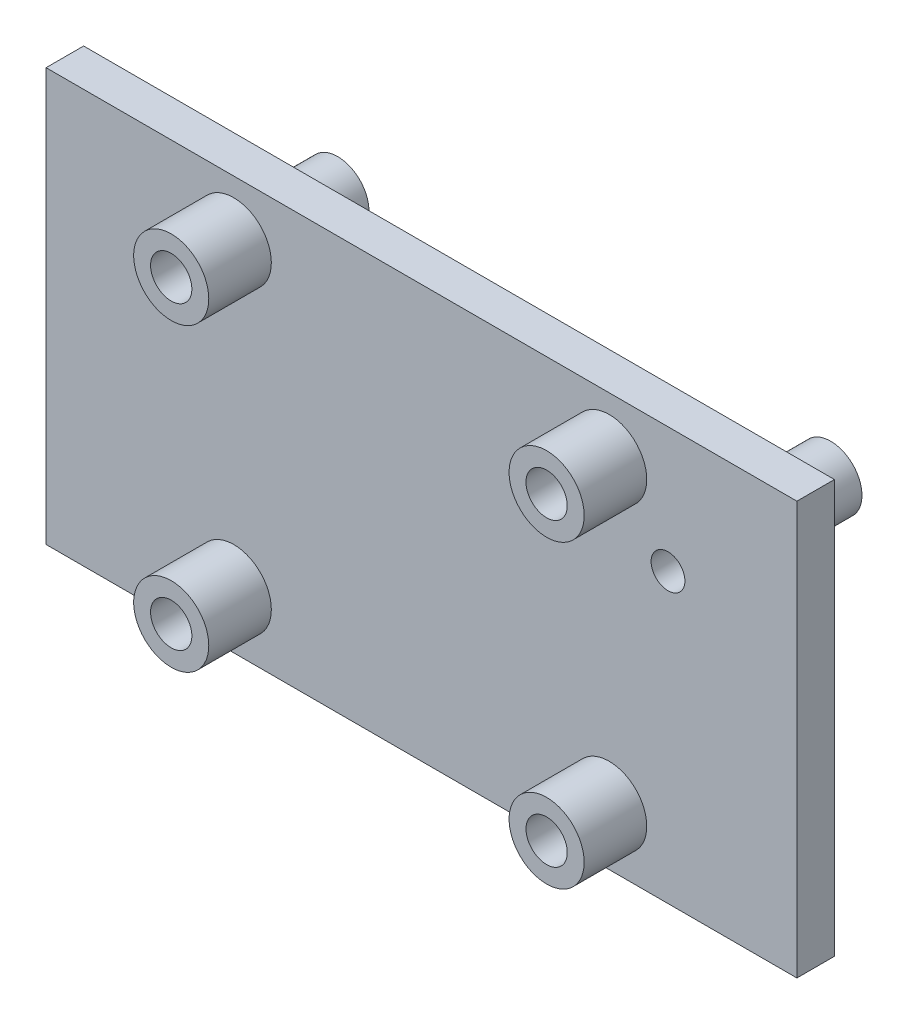
ISO-10303-21;
HEADER;
FILE_DESCRIPTION(('STEP AP214'),'2;1');
FILE_NAME('part.step','',(''),(''),'','','');
FILE_SCHEMA(('AUTOMOTIVE_DESIGN { 1 0 10303 214 1 1 1 1 }'));
ENDSEC;
DATA;
#1=APPLICATION_CONTEXT('core data for automotive mechanical design processes');
#2=APPLICATION_PROTOCOL_DEFINITION('international standard','automotive_design',2000,#1);
#3=PRODUCT_CONTEXT('',#1,'mechanical');
#4=PRODUCT('Part','Part','',(#3));
#5=PRODUCT_RELATED_PRODUCT_CATEGORY('part','',(#4));
#6=PRODUCT_DEFINITION_FORMATION('','',#4);
#7=PRODUCT_DEFINITION_CONTEXT('part definition',#1,'design');
#8=PRODUCT_DEFINITION('design','',#6,#7);
#9=PRODUCT_DEFINITION_SHAPE('','',#8);
#10=(LENGTH_UNIT() NAMED_UNIT(*) SI_UNIT(.MILLI.,.METRE.));
#11=(NAMED_UNIT(*) PLANE_ANGLE_UNIT() SI_UNIT($,.RADIAN.));
#12=(NAMED_UNIT(*) SI_UNIT($,.STERADIAN.) SOLID_ANGLE_UNIT());
#13=UNCERTAINTY_MEASURE_WITH_UNIT(LENGTH_MEASURE(1.E-05),#10,'distance_accuracy_value','');
#14=(GEOMETRIC_REPRESENTATION_CONTEXT(3) GLOBAL_UNCERTAINTY_ASSIGNED_CONTEXT((#13)) GLOBAL_UNIT_ASSIGNED_CONTEXT((#10,
#11,#12)) REPRESENTATION_CONTEXT('',''));
#15=CARTESIAN_POINT('',(0.,0.,0.));
#16=DIRECTION('',(0.,0.,1.));
#17=DIRECTION('',(1.,0.,0.));
#18=AXIS2_PLACEMENT_3D('',#15,#16,#17);
#19=CARTESIAN_POINT('',(196.000002473593,10.,0.));
#20=DIRECTION('',(0.,0.,1.));
#21=DIRECTION('',(1.,0.,0.));
#22=AXIS2_PLACEMENT_3D('',#19,#20,#21);
#23=PLANE('',#22);
#24=CARTESIAN_POINT('',(181.000002473593,22.,0.));
#25=DIRECTION('',(0.,0.,-1.));
#26=DIRECTION('',(1.,0.,0.));
#27=AXIS2_PLACEMENT_3D('',#24,#25,#26);
#28=CIRCLE('',#27,1.65);
#29=CARTESIAN_POINT('',(179.350002473593,22.,0.));
#30=VERTEX_POINT('',#29);
#31=EDGE_CURVE('E280',#30,#30,#28,.T.);
#32=ORIENTED_EDGE('',*,*,#31,.F.);
#33=EDGE_LOOP('',(#32));
#34=FACE_BOUND('',#33,.T.);
#35=CARTESIAN_POINT('',(211.000002473593,22.,0.));
#36=DIRECTION('',(0.,0.,-1.));
#37=DIRECTION('',(1.,0.,0.));
#38=AXIS2_PLACEMENT_3D('',#35,#36,#37);
#39=CIRCLE('',#38,1.65);
#40=CARTESIAN_POINT('',(209.350002473593,22.,0.));
#41=VERTEX_POINT('',#40);
#42=EDGE_CURVE('E292',#41,#41,#39,.T.);
#43=ORIENTED_EDGE('',*,*,#42,.F.);
#44=EDGE_LOOP('',(#43));
#45=FACE_BOUND('',#44,.T.);
#46=CARTESIAN_POINT('',(211.000002473593,-2.,0.));
#47=DIRECTION('',(0.,0.,-1.));
#48=DIRECTION('',(1.,0.,0.));
#49=AXIS2_PLACEMENT_3D('',#46,#47,#48);
#50=CIRCLE('',#49,1.65);
#51=CARTESIAN_POINT('',(209.350002473593,-2.,0.));
#52=VERTEX_POINT('',#51);
#53=EDGE_CURVE('E183',#52,#52,#50,.T.);
#54=ORIENTED_EDGE('',*,*,#53,.F.);
#55=EDGE_LOOP('',(#54));
#56=FACE_BOUND('',#55,.T.);
#57=CARTESIAN_POINT('',(181.000002473593,-2.,0.));
#58=DIRECTION('',(0.,0.,-1.));
#59=DIRECTION('',(1.,0.,0.));
#60=AXIS2_PLACEMENT_3D('',#57,#58,#59);
#61=CIRCLE('',#60,1.65);
#62=CARTESIAN_POINT('',(179.350002473593,-2.,0.));
#63=VERTEX_POINT('',#62);
#64=EDGE_CURVE('E165',#63,#63,#61,.T.);
#65=ORIENTED_EDGE('',*,*,#64,.F.);
#66=EDGE_LOOP('',(#65));
#67=FACE_BOUND('',#66,.T.);
#68=CARTESIAN_POINT('',(215.700002473593,16.5,0.));
#69=DIRECTION('',(0.,0.,1.));
#70=DIRECTION('',(1.,0.,0.));
#71=AXIS2_PLACEMENT_3D('',#68,#69,#70);
#72=CIRCLE('',#71,2.5);
#73=CARTESIAN_POINT('',(213.200002473593,16.5,0.));
#74=VERTEX_POINT('',#73);
#75=EDGE_CURVE('E269',#74,#74,#72,.T.);
#76=ORIENTED_EDGE('',*,*,#75,.T.);
#77=EDGE_LOOP('',(#76));
#78=FACE_BOUND('',#77,.T.);
#79=CARTESIAN_POINT('',(176.300002473593,16.5,0.));
#80=DIRECTION('',(0.,0.,1.));
#81=DIRECTION('',(1.,0.,0.));
#82=AXIS2_PLACEMENT_3D('',#79,#80,#81);
#83=CIRCLE('',#82,2.5);
#84=CARTESIAN_POINT('',(173.800002473593,16.5,0.));
#85=VERTEX_POINT('',#84);
#86=EDGE_CURVE('E220',#85,#85,#83,.T.);
#87=ORIENTED_EDGE('',*,*,#86,.T.);
#88=EDGE_LOOP('',(#87));
#89=FACE_BOUND('',#88,.T.);
#90=DIRECTION('',(0.,-1.,0.));
#91=VECTOR('',#90,1.);
#92=CARTESIAN_POINT('',(166.000002473593,26.5,0.));
#93=LINE('',#92,#91);
#94=CARTESIAN_POINT('',(166.000002473593,26.5,0.));
#95=VERTEX_POINT('',#94);
#96=CARTESIAN_POINT('',(166.000002473593,-6.5,0.));
#97=VERTEX_POINT('',#96);
#98=EDGE_CURVE('E25',#95,#97,#93,.T.);
#99=ORIENTED_EDGE('',*,*,#98,.F.);
#100=DIRECTION('',(-1.,0.,0.));
#101=VECTOR('',#100,1.);
#102=CARTESIAN_POINT('',(226.000002473593,26.5,0.));
#103=LINE('',#102,#101);
#104=CARTESIAN_POINT('',(226.000002473593,26.5,0.));
#105=VERTEX_POINT('',#104);
#106=EDGE_CURVE('E172',#105,#95,#103,.T.);
#107=ORIENTED_EDGE('',*,*,#106,.F.);
#108=DIRECTION('',(0.,1.,0.));
#109=VECTOR('',#108,1.);
#110=CARTESIAN_POINT('',(226.000002473593,-6.5,0.));
#111=LINE('',#110,#109);
#112=CARTESIAN_POINT('',(226.000002473593,-6.5,0.));
#113=VERTEX_POINT('',#112);
#114=EDGE_CURVE('E194',#113,#105,#111,.T.);
#115=ORIENTED_EDGE('',*,*,#114,.F.);
#116=DIRECTION('',(1.,0.,0.));
#117=VECTOR('',#116,1.);
#118=CARTESIAN_POINT('',(166.000002473593,-6.5,0.));
#119=LINE('',#118,#117);
#120=EDGE_CURVE('E195',#97,#113,#119,.T.);
#121=ORIENTED_EDGE('',*,*,#120,.F.);
#122=EDGE_LOOP('',(#99,#107,#115,#121));
#123=FACE_BOUND('',#122,.T.);
#124=ADVANCED_FACE('F17',(#34,#45,#56,#67,#78,#89,#123),#23,.F.);
#125=CARTESIAN_POINT('',(196.000002473593,10.,3.));
#126=DIRECTION('',(0.,0.,1.));
#127=DIRECTION('',(1.,0.,0.));
#128=AXIS2_PLACEMENT_3D('',#125,#126,#127);
#129=PLANE('',#128);
#130=CARTESIAN_POINT('',(176.300002473593,16.5,3.));
#131=DIRECTION('',(0.,0.,-1.));
#132=DIRECTION('',(1.,0.,0.));
#133=AXIS2_PLACEMENT_3D('',#130,#131,#132);
#134=CIRCLE('',#133,1.35000000000002);
#135=CARTESIAN_POINT('',(174.950002473593,16.5,3.));
#136=VERTEX_POINT('',#135);
#137=EDGE_CURVE('E283',#136,#136,#134,.T.);
#138=ORIENTED_EDGE('',*,*,#137,.T.);
#139=EDGE_LOOP('',(#138));
#140=FACE_BOUND('',#139,.T.);
#141=CARTESIAN_POINT('',(215.700002473593,16.5,3.));
#142=DIRECTION('',(0.,0.,-1.));
#143=DIRECTION('',(1.,0.,0.));
#144=AXIS2_PLACEMENT_3D('',#141,#142,#143);
#145=CIRCLE('',#144,1.34999999999998);
#146=CARTESIAN_POINT('',(214.350002473593,16.5,3.));
#147=VERTEX_POINT('',#146);
#148=EDGE_CURVE('E240',#147,#147,#145,.T.);
#149=ORIENTED_EDGE('',*,*,#148,.T.);
#150=EDGE_LOOP('',(#149));
#151=FACE_BOUND('',#150,.T.);
#152=CARTESIAN_POINT('',(211.000002473593,22.,3.));
#153=DIRECTION('',(0.,0.,-1.));
#154=DIRECTION('',(-1.,0.,0.));
#155=AXIS2_PLACEMENT_3D('',#152,#153,#154);
#156=CIRCLE('',#155,3.);
#157=CARTESIAN_POINT('',(214.000002473593,22.,3.));
#158=VERTEX_POINT('',#157);
#159=EDGE_CURVE('E254',#158,#158,#156,.T.);
#160=ORIENTED_EDGE('',*,*,#159,.T.);
#161=EDGE_LOOP('',(#160));
#162=FACE_BOUND('',#161,.T.);
#163=CARTESIAN_POINT('',(181.000002473593,22.,3.));
#164=DIRECTION('',(0.,0.,-1.));
#165=DIRECTION('',(-1.,0.,0.));
#166=AXIS2_PLACEMENT_3D('',#163,#164,#165);
#167=CIRCLE('',#166,3.0000004693866);
#168=CARTESIAN_POINT('',(184.000002942979,22.,3.));
#169=VERTEX_POINT('',#168);
#170=EDGE_CURVE('E245',#169,#169,#167,.T.);
#171=ORIENTED_EDGE('',*,*,#170,.T.);
#172=EDGE_LOOP('',(#171));
#173=FACE_BOUND('',#172,.T.);
#174=CARTESIAN_POINT('',(211.000002473593,-2.,3.));
#175=DIRECTION('',(0.,0.,-1.));
#176=DIRECTION('',(-1.,0.,0.));
#177=AXIS2_PLACEMENT_3D('',#174,#175,#176);
#178=CIRCLE('',#177,3.);
#179=CARTESIAN_POINT('',(214.000002473593,-2.,3.));
#180=VERTEX_POINT('',#179);
#181=EDGE_CURVE('E230',#180,#180,#178,.T.);
#182=ORIENTED_EDGE('',*,*,#181,.T.);
#183=EDGE_LOOP('',(#182));
#184=FACE_BOUND('',#183,.T.);
#185=CARTESIAN_POINT('',(181.000002473593,-2.,3.));
#186=DIRECTION('',(0.,0.,-1.));
#187=DIRECTION('',(-1.,0.,0.));
#188=AXIS2_PLACEMENT_3D('',#185,#186,#187);
#189=CIRCLE('',#188,3.);
#190=CARTESIAN_POINT('',(184.000002473593,-2.,3.));
#191=VERTEX_POINT('',#190);
#192=EDGE_CURVE('E436',#191,#191,#189,.T.);
#193=ORIENTED_EDGE('',*,*,#192,.T.);
#194=EDGE_LOOP('',(#193));
#195=FACE_BOUND('',#194,.T.);
#196=DIRECTION('',(0.,-1.,0.));
#197=VECTOR('',#196,1.);
#198=CARTESIAN_POINT('',(166.000002473593,26.5,3.));
#199=LINE('',#198,#197);
#200=CARTESIAN_POINT('',(166.000002473593,26.5,3.));
#201=VERTEX_POINT('',#200);
#202=CARTESIAN_POINT('',(166.000002473593,-6.5,3.));
#203=VERTEX_POINT('',#202);
#204=EDGE_CURVE('E11',#201,#203,#199,.T.);
#205=ORIENTED_EDGE('',*,*,#204,.T.);
#206=DIRECTION('',(1.,0.,0.));
#207=VECTOR('',#206,1.);
#208=CARTESIAN_POINT('',(166.000002473593,-6.5,3.));
#209=LINE('',#208,#207);
#210=CARTESIAN_POINT('',(226.000002473593,-6.5,3.));
#211=VERTEX_POINT('',#210);
#212=EDGE_CURVE('E198',#203,#211,#209,.T.);
#213=ORIENTED_EDGE('',*,*,#212,.T.);
#214=DIRECTION('',(0.,1.,0.));
#215=VECTOR('',#214,1.);
#216=CARTESIAN_POINT('',(226.000002473593,-6.5,3.));
#217=LINE('',#216,#215);
#218=CARTESIAN_POINT('',(226.000002473593,26.5,3.));
#219=VERTEX_POINT('',#218);
#220=EDGE_CURVE('E202',#211,#219,#217,.T.);
#221=ORIENTED_EDGE('',*,*,#220,.T.);
#222=DIRECTION('',(-1.,0.,0.));
#223=VECTOR('',#222,1.);
#224=CARTESIAN_POINT('',(226.000002473593,26.5,3.));
#225=LINE('',#224,#223);
#226=EDGE_CURVE('E187',#219,#201,#225,.T.);
#227=ORIENTED_EDGE('',*,*,#226,.T.);
#228=EDGE_LOOP('',(#205,#213,#221,#227));
#229=FACE_BOUND('',#228,.T.);
#230=ADVANCED_FACE('F310',(#140,#151,#162,#173,#184,#195,#229),#129,.T.);
#231=CARTESIAN_POINT('',(166.000002473593,26.5,0.));
#232=DIRECTION('',(-1.,0.,0.));
#233=DIRECTION('',(0.,0.,1.));
#234=AXIS2_PLACEMENT_3D('',#231,#232,#233);
#235=PLANE('',#234);
#236=ORIENTED_EDGE('',*,*,#98,.T.);
#237=DIRECTION('',(0.,0.,1.));
#238=VECTOR('',#237,1.);
#239=CARTESIAN_POINT('',(166.000002473593,-6.5,0.));
#240=LINE('',#239,#238);
#241=EDGE_CURVE('E207',#97,#203,#240,.T.);
#242=ORIENTED_EDGE('',*,*,#241,.T.);
#243=ORIENTED_EDGE('',*,*,#204,.F.);
#244=DIRECTION('',(0.,0.,1.));
#245=VECTOR('',#244,1.);
#246=CARTESIAN_POINT('',(166.000002473593,26.5,0.));
#247=LINE('',#246,#245);
#248=EDGE_CURVE('E180',#95,#201,#247,.T.);
#249=ORIENTED_EDGE('',*,*,#248,.F.);
#250=EDGE_LOOP('',(#236,#242,#243,#249));
#251=FACE_BOUND('',#250,.T.);
#252=ADVANCED_FACE('F321',(#251),#235,.T.);
#253=CARTESIAN_POINT('',(166.000002473593,-6.5,0.));
#254=DIRECTION('',(0.,-1.,0.));
#255=DIRECTION('',(0.,0.,-1.));
#256=AXIS2_PLACEMENT_3D('',#253,#254,#255);
#257=PLANE('',#256);
#258=ORIENTED_EDGE('',*,*,#120,.T.);
#259=DIRECTION('',(0.,0.,1.));
#260=VECTOR('',#259,1.);
#261=CARTESIAN_POINT('',(226.000002473593,-6.5,0.));
#262=LINE('',#261,#260);
#263=EDGE_CURVE('E199',#113,#211,#262,.T.);
#264=ORIENTED_EDGE('',*,*,#263,.T.);
#265=ORIENTED_EDGE('',*,*,#212,.F.);
#266=ORIENTED_EDGE('',*,*,#241,.F.);
#267=EDGE_LOOP('',(#258,#264,#265,#266));
#268=FACE_BOUND('',#267,.T.);
#269=ADVANCED_FACE('F331',(#268),#257,.T.);
#270=CARTESIAN_POINT('',(226.000002473593,-6.5,0.));
#271=DIRECTION('',(1.,0.,0.));
#272=DIRECTION('',(0.,1.,0.));
#273=AXIS2_PLACEMENT_3D('',#270,#271,#272);
#274=PLANE('',#273);
#275=ORIENTED_EDGE('',*,*,#114,.T.);
#276=DIRECTION('',(0.,0.,1.));
#277=VECTOR('',#276,1.);
#278=CARTESIAN_POINT('',(226.000002473593,26.5,0.));
#279=LINE('',#278,#277);
#280=EDGE_CURVE('E190',#105,#219,#279,.T.);
#281=ORIENTED_EDGE('',*,*,#280,.T.);
#282=ORIENTED_EDGE('',*,*,#220,.F.);
#283=ORIENTED_EDGE('',*,*,#263,.F.);
#284=EDGE_LOOP('',(#275,#281,#282,#283));
#285=FACE_BOUND('',#284,.T.);
#286=ADVANCED_FACE('F328',(#285),#274,.T.);
#287=CARTESIAN_POINT('',(226.000002473593,26.5,0.));
#288=DIRECTION('',(0.,1.,0.));
#289=DIRECTION('',(1.,0.,0.));
#290=AXIS2_PLACEMENT_3D('',#287,#288,#289);
#291=PLANE('',#290);
#292=ORIENTED_EDGE('',*,*,#106,.T.);
#293=ORIENTED_EDGE('',*,*,#248,.T.);
#294=ORIENTED_EDGE('',*,*,#226,.F.);
#295=ORIENTED_EDGE('',*,*,#280,.F.);
#296=EDGE_LOOP('',(#292,#293,#294,#295));
#297=FACE_BOUND('',#296,.T.);
#298=ADVANCED_FACE('F325',(#297),#291,.T.);
#299=CARTESIAN_POINT('',(181.000002473593,-2.,0.));
#300=DIRECTION('',(0.,0.,1.));
#301=DIRECTION('',(1.,0.,0.));
#302=AXIS2_PLACEMENT_3D('',#299,#300,#301);
#303=CYLINDRICAL_SURFACE('',#302,1.65);
#304=CARTESIAN_POINT('',(181.000002473593,-2.,8.));
#305=DIRECTION('',(0.,0.,-1.));
#306=DIRECTION('',(-1.,0.,0.));
#307=AXIS2_PLACEMENT_3D('',#304,#305,#306);
#308=CIRCLE('',#307,1.65);
#309=CARTESIAN_POINT('',(179.350002473593,-2.,8.));
#310=VERTEX_POINT('',#309);
#311=EDGE_CURVE('E338',#310,#310,#308,.T.);
#312=ORIENTED_EDGE('',*,*,#311,.F.);
#313=DIRECTION('',(0.,0.,-1.));
#314=VECTOR('',#313,1.);
#315=CARTESIAN_POINT('',(179.350002473593,-2.,0.));
#316=LINE('',#315,#314);
#317=EDGE_CURVE('E168',#310,#63,#316,.T.);
#318=ORIENTED_EDGE('',*,*,#317,.T.);
#319=ORIENTED_EDGE('',*,*,#64,.T.);
#320=ORIENTED_EDGE('',*,*,#317,.F.);
#321=EDGE_LOOP('',(#312,#318,#319,#320));
#322=FACE_BOUND('',#321,.T.);
#323=ADVANCED_FACE('F167',(#322),#303,.F.);
#324=CARTESIAN_POINT('',(211.000002473593,-2.,0.));
#325=DIRECTION('',(0.,0.,1.));
#326=DIRECTION('',(1.,0.,0.));
#327=AXIS2_PLACEMENT_3D('',#324,#325,#326);
#328=CYLINDRICAL_SURFACE('',#327,1.65);
#329=CARTESIAN_POINT('',(211.000002473593,-2.,8.));
#330=DIRECTION('',(0.,0.,-1.));
#331=DIRECTION('',(-1.,0.,0.));
#332=AXIS2_PLACEMENT_3D('',#329,#330,#331);
#333=CIRCLE('',#332,1.65);
#334=CARTESIAN_POINT('',(209.350002473593,-2.,8.));
#335=VERTEX_POINT('',#334);
#336=EDGE_CURVE('E225',#335,#335,#333,.T.);
#337=ORIENTED_EDGE('',*,*,#336,.F.);
#338=DIRECTION('',(0.,0.,-1.));
#339=VECTOR('',#338,1.);
#340=CARTESIAN_POINT('',(209.350002473593,-2.,0.));
#341=LINE('',#340,#339);
#342=EDGE_CURVE('E239',#335,#52,#341,.T.);
#343=ORIENTED_EDGE('',*,*,#342,.T.);
#344=ORIENTED_EDGE('',*,*,#53,.T.);
#345=ORIENTED_EDGE('',*,*,#342,.F.);
#346=EDGE_LOOP('',(#337,#343,#344,#345));
#347=FACE_BOUND('',#346,.T.);
#348=ADVANCED_FACE('F307',(#347),#328,.F.);
#349=CARTESIAN_POINT('',(215.700002473593,16.5,0.));
#350=DIRECTION('',(0.,0.,1.));
#351=DIRECTION('',(1.,0.,0.));
#352=AXIS2_PLACEMENT_3D('',#349,#350,#351);
#353=CYLINDRICAL_SURFACE('',#352,1.34999999999998);
#354=ORIENTED_EDGE('',*,*,#148,.F.);
#355=DIRECTION('',(0.,0.,-1.));
#356=VECTOR('',#355,1.);
#357=CARTESIAN_POINT('',(214.350002473593,16.5,0.));
#358=LINE('',#357,#356);
#359=CARTESIAN_POINT('',(214.350002473593,16.5,-10.));
#360=VERTEX_POINT('',#359);
#361=EDGE_CURVE('E236',#147,#360,#358,.T.);
#362=ORIENTED_EDGE('',*,*,#361,.T.);
#363=CARTESIAN_POINT('',(215.700002473593,16.5,-10.));
#364=DIRECTION('',(0.,0.,1.));
#365=DIRECTION('',(1.,0.,0.));
#366=AXIS2_PLACEMENT_3D('',#363,#364,#365);
#367=CIRCLE('',#366,1.34999999999998);
#368=EDGE_CURVE('E272',#360,#360,#367,.T.);
#369=ORIENTED_EDGE('',*,*,#368,.F.);
#370=ORIENTED_EDGE('',*,*,#361,.F.);
#371=EDGE_LOOP('',(#354,#362,#369,#370));
#372=FACE_BOUND('',#371,.T.);
#373=ADVANCED_FACE('F408',(#372),#353,.F.);
#374=CARTESIAN_POINT('',(211.000002473593,22.,0.));
#375=DIRECTION('',(0.,0.,1.));
#376=DIRECTION('',(1.,0.,0.));
#377=AXIS2_PLACEMENT_3D('',#374,#375,#376);
#378=CYLINDRICAL_SURFACE('',#377,1.65);
#379=CARTESIAN_POINT('',(211.000002473593,22.,8.));
#380=DIRECTION('',(0.,0.,-1.));
#381=DIRECTION('',(-1.,0.,0.));
#382=AXIS2_PLACEMENT_3D('',#379,#380,#381);
#383=CIRCLE('',#382,1.65);
#384=CARTESIAN_POINT('',(209.350002473593,22.,8.));
#385=VERTEX_POINT('',#384);
#386=EDGE_CURVE('E342',#385,#385,#383,.T.);
#387=ORIENTED_EDGE('',*,*,#386,.F.);
#388=DIRECTION('',(0.,0.,-1.));
#389=VECTOR('',#388,1.);
#390=CARTESIAN_POINT('',(209.350002473593,22.,0.));
#391=LINE('',#390,#389);
#392=EDGE_CURVE('E288',#385,#41,#391,.T.);
#393=ORIENTED_EDGE('',*,*,#392,.T.);
#394=ORIENTED_EDGE('',*,*,#42,.T.);
#395=ORIENTED_EDGE('',*,*,#392,.F.);
#396=EDGE_LOOP('',(#387,#393,#394,#395));
#397=FACE_BOUND('',#396,.T.);
#398=ADVANCED_FACE('F392',(#397),#378,.F.);
#399=CARTESIAN_POINT('',(176.300002473593,16.5,0.));
#400=DIRECTION('',(0.,0.,1.));
#401=DIRECTION('',(1.,0.,0.));
#402=AXIS2_PLACEMENT_3D('',#399,#400,#401);
#403=CYLINDRICAL_SURFACE('',#402,1.35000000000002);
#404=ORIENTED_EDGE('',*,*,#137,.F.);
#405=DIRECTION('',(0.,0.,-1.));
#406=VECTOR('',#405,1.);
#407=CARTESIAN_POINT('',(174.950002473593,16.5,0.));
#408=LINE('',#407,#406);
#409=CARTESIAN_POINT('',(174.950002473593,16.5,-10.));
#410=VERTEX_POINT('',#409);
#411=EDGE_CURVE('E287',#136,#410,#408,.T.);
#412=ORIENTED_EDGE('',*,*,#411,.T.);
#413=CARTESIAN_POINT('',(176.300002473593,16.5,-10.));
#414=DIRECTION('',(0.,0.,1.));
#415=DIRECTION('',(1.,0.,0.));
#416=AXIS2_PLACEMENT_3D('',#413,#414,#415);
#417=CIRCLE('',#416,1.35000000000002);
#418=EDGE_CURVE('E223',#410,#410,#417,.T.);
#419=ORIENTED_EDGE('',*,*,#418,.F.);
#420=ORIENTED_EDGE('',*,*,#411,.F.);
#421=EDGE_LOOP('',(#404,#412,#419,#420));
#422=FACE_BOUND('',#421,.T.);
#423=ADVANCED_FACE('F376',(#422),#403,.F.);
#424=CARTESIAN_POINT('',(181.000002473593,22.,0.));
#425=DIRECTION('',(0.,0.,1.));
#426=DIRECTION('',(1.,0.,0.));
#427=AXIS2_PLACEMENT_3D('',#424,#425,#426);
#428=CYLINDRICAL_SURFACE('',#427,1.65);
#429=CARTESIAN_POINT('',(181.000002473593,22.,8.));
#430=DIRECTION('',(0.,0.,-1.));
#431=DIRECTION('',(-1.,0.,0.));
#432=AXIS2_PLACEMENT_3D('',#429,#430,#431);
#433=CIRCLE('',#432,1.65);
#434=CARTESIAN_POINT('',(179.350002473593,22.,8.));
#435=VERTEX_POINT('',#434);
#436=EDGE_CURVE('E235',#435,#435,#433,.T.);
#437=ORIENTED_EDGE('',*,*,#436,.F.);
#438=DIRECTION('',(0.,0.,-1.));
#439=VECTOR('',#438,1.);
#440=CARTESIAN_POINT('',(179.350002473593,22.,0.));
#441=LINE('',#440,#439);
#442=EDGE_CURVE('E276',#435,#30,#441,.T.);
#443=ORIENTED_EDGE('',*,*,#442,.T.);
#444=ORIENTED_EDGE('',*,*,#31,.T.);
#445=ORIENTED_EDGE('',*,*,#442,.F.);
#446=EDGE_LOOP('',(#437,#443,#444,#445));
#447=FACE_BOUND('',#446,.T.);
#448=ADVANCED_FACE('F372',(#447),#428,.F.);
#449=CARTESIAN_POINT('',(215.700002473593,16.5,-10.));
#450=DIRECTION('',(0.,0.,-1.));
#451=DIRECTION('',(0.,-1.,0.));
#452=AXIS2_PLACEMENT_3D('',#449,#450,#451);
#453=PLANE('',#452);
#454=ORIENTED_EDGE('',*,*,#368,.T.);
#455=EDGE_LOOP('',(#454));
#456=FACE_BOUND('',#455,.T.);
#457=CARTESIAN_POINT('',(215.700002473593,16.5,-10.));
#458=DIRECTION('',(0.,0.,-1.));
#459=DIRECTION('',(1.,0.,0.));
#460=AXIS2_PLACEMENT_3D('',#457,#458,#459);
#461=CIRCLE('',#460,2.5);
#462=CARTESIAN_POINT('',(213.200002473593,16.5,-10.));
#463=VERTEX_POINT('',#462);
#464=EDGE_CURVE('E262',#463,#463,#461,.T.);
#465=ORIENTED_EDGE('',*,*,#464,.T.);
#466=EDGE_LOOP('',(#465));
#467=FACE_BOUND('',#466,.T.);
#468=ADVANCED_FACE('F375',(#456,#467),#453,.T.);
#469=CARTESIAN_POINT('',(215.700002473593,16.5,0.));
#470=DIRECTION('',(0.,0.,-1.));
#471=DIRECTION('',(1.,0.,0.));
#472=AXIS2_PLACEMENT_3D('',#469,#470,#471);
#473=CYLINDRICAL_SURFACE('',#472,2.5);
#474=ORIENTED_EDGE('',*,*,#464,.F.);
#475=DIRECTION('',(0.,0.,1.));
#476=VECTOR('',#475,1.);
#477=CARTESIAN_POINT('',(213.200002473593,16.5,0.));
#478=LINE('',#477,#476);
#479=EDGE_CURVE('E266',#463,#74,#478,.T.);
#480=ORIENTED_EDGE('',*,*,#479,.T.);
#481=ORIENTED_EDGE('',*,*,#75,.F.);
#482=ORIENTED_EDGE('',*,*,#479,.F.);
#483=EDGE_LOOP('',(#474,#480,#481,#482));
#484=FACE_BOUND('',#483,.T.);
#485=ADVANCED_FACE('F400',(#484),#473,.T.);
#486=CARTESIAN_POINT('',(176.300002473593,16.5,-10.));
#487=DIRECTION('',(0.,0.,-1.));
#488=DIRECTION('',(0.,-1.,0.));
#489=AXIS2_PLACEMENT_3D('',#486,#487,#488);
#490=PLANE('',#489);
#491=ORIENTED_EDGE('',*,*,#418,.T.);
#492=EDGE_LOOP('',(#491));
#493=FACE_BOUND('',#492,.T.);
#494=CARTESIAN_POINT('',(176.300002473593,16.5,-10.));
#495=DIRECTION('',(0.,0.,-1.));
#496=DIRECTION('',(1.,0.,0.));
#497=AXIS2_PLACEMENT_3D('',#494,#495,#496);
#498=CIRCLE('',#497,2.5);
#499=CARTESIAN_POINT('',(173.800002473593,16.5,-10.));
#500=VERTEX_POINT('',#499);
#501=EDGE_CURVE('E258',#500,#500,#498,.T.);
#502=ORIENTED_EDGE('',*,*,#501,.T.);
#503=EDGE_LOOP('',(#502));
#504=FACE_BOUND('',#503,.T.);
#505=ADVANCED_FACE('F396',(#493,#504),#490,.T.);
#506=CARTESIAN_POINT('',(176.300002473593,16.5,0.));
#507=DIRECTION('',(0.,0.,-1.));
#508=DIRECTION('',(1.,0.,0.));
#509=AXIS2_PLACEMENT_3D('',#506,#507,#508);
#510=CYLINDRICAL_SURFACE('',#509,2.5);
#511=ORIENTED_EDGE('',*,*,#501,.F.);
#512=DIRECTION('',(0.,0.,1.));
#513=VECTOR('',#512,1.);
#514=CARTESIAN_POINT('',(173.800002473593,16.5,0.));
#515=LINE('',#514,#513);
#516=EDGE_CURVE('E224',#500,#85,#515,.T.);
#517=ORIENTED_EDGE('',*,*,#516,.T.);
#518=ORIENTED_EDGE('',*,*,#86,.F.);
#519=ORIENTED_EDGE('',*,*,#516,.F.);
#520=EDGE_LOOP('',(#511,#517,#518,#519));
#521=FACE_BOUND('',#520,.T.);
#522=ADVANCED_FACE('F388',(#521),#510,.T.);
#523=CARTESIAN_POINT('',(211.000002473593,22.,8.));
#524=DIRECTION('',(0.,0.,1.));
#525=DIRECTION('',(1.,0.,0.));
#526=AXIS2_PLACEMENT_3D('',#523,#524,#525);
#527=PLANE('',#526);
#528=ORIENTED_EDGE('',*,*,#386,.T.);
#529=EDGE_LOOP('',(#528));
#530=FACE_BOUND('',#529,.T.);
#531=CARTESIAN_POINT('',(211.000002473593,22.,8.));
#532=DIRECTION('',(0.,0.,1.));
#533=DIRECTION('',(-1.,0.,0.));
#534=AXIS2_PLACEMENT_3D('',#531,#532,#533);
#535=CIRCLE('',#534,3.);
#536=CARTESIAN_POINT('',(214.000002473593,22.,8.));
#537=VERTEX_POINT('',#536);
#538=EDGE_CURVE('E231',#537,#537,#535,.T.);
#539=ORIENTED_EDGE('',*,*,#538,.T.);
#540=EDGE_LOOP('',(#539));
#541=FACE_BOUND('',#540,.T.);
#542=ADVANCED_FACE('F384',(#530,#541),#527,.T.);
#543=CARTESIAN_POINT('',(211.000002473593,22.,3.));
#544=DIRECTION('',(0.,0.,1.));
#545=DIRECTION('',(-1.,0.,0.));
#546=AXIS2_PLACEMENT_3D('',#543,#544,#545);
#547=CYLINDRICAL_SURFACE('',#546,3.);
#548=ORIENTED_EDGE('',*,*,#538,.F.);
#549=DIRECTION('',(0.,0.,-1.));
#550=VECTOR('',#549,1.);
#551=CARTESIAN_POINT('',(214.000002473593,22.,3.));
#552=LINE('',#551,#550);
#553=EDGE_CURVE('E234',#537,#158,#552,.T.);
#554=ORIENTED_EDGE('',*,*,#553,.T.);
#555=ORIENTED_EDGE('',*,*,#159,.F.);
#556=ORIENTED_EDGE('',*,*,#553,.F.);
#557=EDGE_LOOP('',(#548,#554,#555,#556));
#558=FACE_BOUND('',#557,.T.);
#559=ADVANCED_FACE('F379',(#558),#547,.T.);
#560=CARTESIAN_POINT('',(181.000002473593,22.,8.));
#561=DIRECTION('',(0.,0.,1.));
#562=DIRECTION('',(1.,0.,0.));
#563=AXIS2_PLACEMENT_3D('',#560,#561,#562);
#564=PLANE('',#563);
#565=ORIENTED_EDGE('',*,*,#436,.T.);
#566=EDGE_LOOP('',(#565));
#567=FACE_BOUND('',#566,.T.);
#568=CARTESIAN_POINT('',(181.000002473593,22.,8.));
#569=DIRECTION('',(0.,0.,1.));
#570=DIRECTION('',(-1.,0.,0.));
#571=AXIS2_PLACEMENT_3D('',#568,#569,#570);
#572=CIRCLE('',#571,3.0000004693866);
#573=CARTESIAN_POINT('',(184.000002942979,22.,8.));
#574=VERTEX_POINT('',#573);
#575=EDGE_CURVE('E229',#574,#574,#572,.T.);
#576=ORIENTED_EDGE('',*,*,#575,.T.);
#577=EDGE_LOOP('',(#576));
#578=FACE_BOUND('',#577,.T.);
#579=ADVANCED_FACE('F367',(#567,#578),#564,.T.);
#580=CARTESIAN_POINT('',(181.000002473593,22.,3.));
#581=DIRECTION('',(0.,0.,1.));
#582=DIRECTION('',(-1.,0.,0.));
#583=AXIS2_PLACEMENT_3D('',#580,#581,#582);
#584=CYLINDRICAL_SURFACE('',#583,3.0000004693866);
#585=ORIENTED_EDGE('',*,*,#575,.F.);
#586=DIRECTION('',(0.,0.,-1.));
#587=VECTOR('',#586,1.);
#588=CARTESIAN_POINT('',(184.000002942979,22.,3.));
#589=LINE('',#588,#587);
#590=EDGE_CURVE('E241',#574,#169,#589,.T.);
#591=ORIENTED_EDGE('',*,*,#590,.T.);
#592=ORIENTED_EDGE('',*,*,#170,.F.);
#593=ORIENTED_EDGE('',*,*,#590,.F.);
#594=EDGE_LOOP('',(#585,#591,#592,#593));
#595=FACE_BOUND('',#594,.T.);
#596=ADVANCED_FACE('F358',(#595),#584,.T.);
#597=CARTESIAN_POINT('',(211.000002473593,-2.,8.));
#598=DIRECTION('',(0.,0.,1.));
#599=DIRECTION('',(1.,0.,0.));
#600=AXIS2_PLACEMENT_3D('',#597,#598,#599);
#601=PLANE('',#600);
#602=ORIENTED_EDGE('',*,*,#336,.T.);
#603=EDGE_LOOP('',(#602));
#604=FACE_BOUND('',#603,.T.);
#605=CARTESIAN_POINT('',(211.000002473593,-2.,8.));
#606=DIRECTION('',(0.,0.,1.));
#607=DIRECTION('',(-1.,0.,0.));
#608=AXIS2_PLACEMENT_3D('',#605,#606,#607);
#609=CIRCLE('',#608,3.);
#610=CARTESIAN_POINT('',(214.000002473593,-2.,8.));
#611=VERTEX_POINT('',#610);
#612=EDGE_CURVE('E343',#611,#611,#609,.T.);
#613=ORIENTED_EDGE('',*,*,#612,.T.);
#614=EDGE_LOOP('',(#613));
#615=FACE_BOUND('',#614,.T.);
#616=ADVANCED_FACE('F356',(#604,#615),#601,.T.);
#617=CARTESIAN_POINT('',(211.000002473593,-2.,3.));
#618=DIRECTION('',(0.,0.,1.));
#619=DIRECTION('',(-1.,0.,0.));
#620=AXIS2_PLACEMENT_3D('',#617,#618,#619);
#621=CYLINDRICAL_SURFACE('',#620,3.);
#622=ORIENTED_EDGE('',*,*,#612,.F.);
#623=DIRECTION('',(0.,0.,-1.));
#624=VECTOR('',#623,1.);
#625=CARTESIAN_POINT('',(214.000002473593,-2.,3.));
#626=LINE('',#625,#624);
#627=EDGE_CURVE('E218',#611,#180,#626,.T.);
#628=ORIENTED_EDGE('',*,*,#627,.T.);
#629=ORIENTED_EDGE('',*,*,#181,.F.);
#630=ORIENTED_EDGE('',*,*,#627,.F.);
#631=EDGE_LOOP('',(#622,#628,#629,#630));
#632=FACE_BOUND('',#631,.T.);
#633=ADVANCED_FACE('F354',(#632),#621,.T.);
#634=CARTESIAN_POINT('',(181.000002473593,-2.,8.));
#635=DIRECTION('',(0.,0.,1.));
#636=DIRECTION('',(1.,0.,0.));
#637=AXIS2_PLACEMENT_3D('',#634,#635,#636);
#638=PLANE('',#637);
#639=ORIENTED_EDGE('',*,*,#311,.T.);
#640=EDGE_LOOP('',(#639));
#641=FACE_BOUND('',#640,.T.);
#642=CARTESIAN_POINT('',(181.000002473593,-2.,8.));
#643=DIRECTION('',(0.,0.,1.));
#644=DIRECTION('',(-1.,0.,0.));
#645=AXIS2_PLACEMENT_3D('',#642,#643,#644);
#646=CIRCLE('',#645,3.);
#647=CARTESIAN_POINT('',(184.000002473593,-2.,8.));
#648=VERTEX_POINT('',#647);
#649=EDGE_CURVE('E443',#648,#648,#646,.T.);
#650=ORIENTED_EDGE('',*,*,#649,.T.);
#651=EDGE_LOOP('',(#650));
#652=FACE_BOUND('',#651,.T.);
#653=ADVANCED_FACE('F365',(#641,#652),#638,.T.);
#654=CARTESIAN_POINT('',(181.000002473593,-2.,3.));
#655=DIRECTION('',(0.,0.,1.));
#656=DIRECTION('',(-1.,0.,0.));
#657=AXIS2_PLACEMENT_3D('',#654,#655,#656);
#658=CYLINDRICAL_SURFACE('',#657,3.);
#659=ORIENTED_EDGE('',*,*,#649,.F.);
#660=DIRECTION('',(0.,0.,-1.));
#661=VECTOR('',#660,1.);
#662=CARTESIAN_POINT('',(184.000002473593,-2.,3.));
#663=LINE('',#662,#661);
#664=EDGE_CURVE('E440',#648,#191,#663,.T.);
#665=ORIENTED_EDGE('',*,*,#664,.T.);
#666=ORIENTED_EDGE('',*,*,#192,.F.);
#667=ORIENTED_EDGE('',*,*,#664,.F.);
#668=EDGE_LOOP('',(#659,#665,#666,#667));
#669=FACE_BOUND('',#668,.T.);
#670=ADVANCED_FACE('F481',(#669),#658,.T.);
#671=CLOSED_SHELL('',(#124,#230,#252,#269,#286,#298,#323,#348,#373,#398,#423,#448,#468,#485,
#505,#522,#542,#559,#579,#596,#616,#633,#653,#670));
#672=MANIFOLD_SOLID_BREP('B1',#671);
#673=ADVANCED_BREP_SHAPE_REPRESENTATION('',(#18,#672),#14);
#674=SHAPE_DEFINITION_REPRESENTATION(#9,#673);
ENDSEC;
END-ISO-10303-21;
